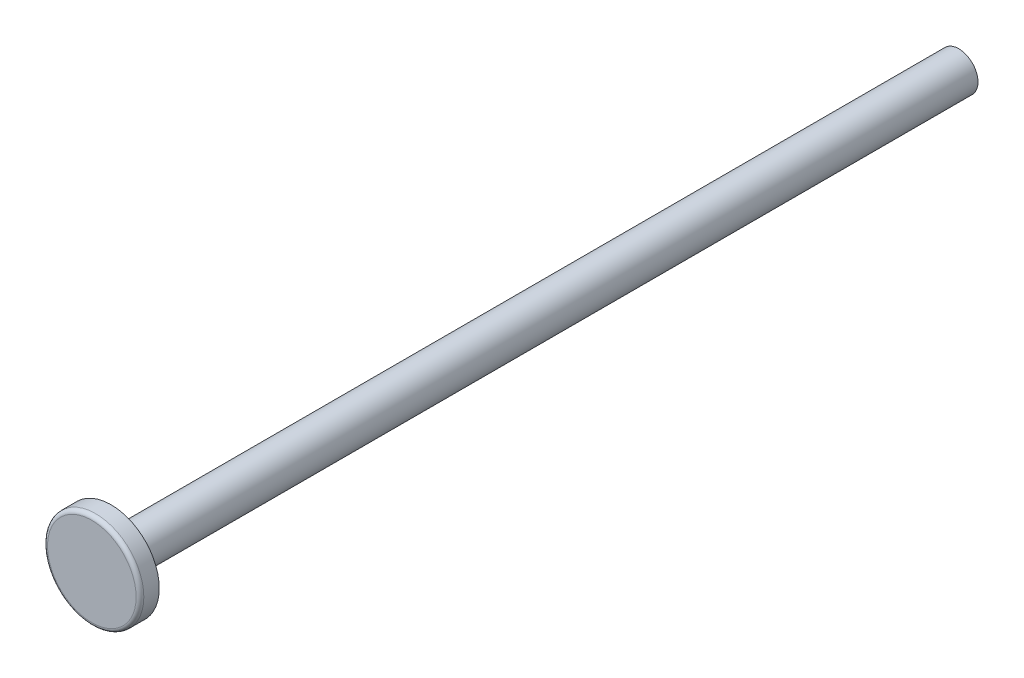
ISO-10303-21;
HEADER;
FILE_DESCRIPTION(('STEP AP214'),'2;1');
FILE_NAME('part.step','',(''),(''),'','','');
FILE_SCHEMA(('AUTOMOTIVE_DESIGN { 1 0 10303 214 1 1 1 1 }'));
ENDSEC;
DATA;
#1=APPLICATION_CONTEXT('core data for automotive mechanical design processes');
#2=APPLICATION_PROTOCOL_DEFINITION('international standard','automotive_design',2000,#1);
#3=PRODUCT_CONTEXT('',#1,'mechanical');
#4=PRODUCT('Part','Part','',(#3));
#5=PRODUCT_RELATED_PRODUCT_CATEGORY('part','',(#4));
#6=PRODUCT_DEFINITION_FORMATION('','',#4);
#7=PRODUCT_DEFINITION_CONTEXT('part definition',#1,'design');
#8=PRODUCT_DEFINITION('design','',#6,#7);
#9=PRODUCT_DEFINITION_SHAPE('','',#8);
#10=(LENGTH_UNIT() NAMED_UNIT(*) SI_UNIT(.MILLI.,.METRE.));
#11=(NAMED_UNIT(*) PLANE_ANGLE_UNIT() SI_UNIT($,.RADIAN.));
#12=(NAMED_UNIT(*) SI_UNIT($,.STERADIAN.) SOLID_ANGLE_UNIT());
#13=UNCERTAINTY_MEASURE_WITH_UNIT(LENGTH_MEASURE(1.E-05),#10,'distance_accuracy_value','');
#14=(GEOMETRIC_REPRESENTATION_CONTEXT(3) GLOBAL_UNCERTAINTY_ASSIGNED_CONTEXT((#13)) GLOBAL_UNIT_ASSIGNED_CONTEXT((#10,
#11,#12)) REPRESENTATION_CONTEXT('',''));
#15=CARTESIAN_POINT('',(0.,0.,0.));
#16=DIRECTION('',(0.,0.,1.));
#17=DIRECTION('',(1.,0.,0.));
#18=AXIS2_PLACEMENT_3D('',#15,#16,#17);
#19=CARTESIAN_POINT('',(0.,0.,110.));
#20=DIRECTION('',(0.,0.,-1.));
#21=DIRECTION('',(-1.,0.,0.));
#22=AXIS2_PLACEMENT_3D('',#19,#20,#21);
#23=CYLINDRICAL_SURFACE('',#22,5.);
#24=CARTESIAN_POINT('',(0.,0.,110.));
#25=DIRECTION('',(0.,0.,1.));
#26=DIRECTION('',(1.,0.,0.));
#27=AXIS2_PLACEMENT_3D('',#24,#25,#26);
#28=CIRCLE('',#27,5.);
#29=CARTESIAN_POINT('',(5.,0.,110.));
#30=VERTEX_POINT('',#29);
#31=EDGE_CURVE('E46',#30,#30,#28,.T.);
#32=ORIENTED_EDGE('',*,*,#31,.F.);
#33=EDGE_LOOP('',(#32));
#34=FACE_BOUND('',#33,.T.);
#35=CARTESIAN_POINT('',(0.,0.,-110.));
#36=DIRECTION('',(0.,0.,1.));
#37=DIRECTION('',(1.,0.,0.));
#38=AXIS2_PLACEMENT_3D('',#35,#36,#37);
#39=CIRCLE('',#38,5.);
#40=CARTESIAN_POINT('',(5.,0.,-110.));
#41=VERTEX_POINT('',#40);
#42=EDGE_CURVE('E50',#41,#41,#39,.T.);
#43=ORIENTED_EDGE('',*,*,#42,.T.);
#44=EDGE_LOOP('',(#43));
#45=FACE_BOUND('',#44,.T.);
#46=ADVANCED_FACE('F35',(#34,#45),#23,.T.);
#47=CARTESIAN_POINT('',(0.,0.,-110.));
#48=DIRECTION('',(0.,0.,1.));
#49=DIRECTION('',(1.,0.,0.));
#50=AXIS2_PLACEMENT_3D('',#47,#48,#49);
#51=PLANE('',#50);
#52=ORIENTED_EDGE('',*,*,#42,.F.);
#53=EDGE_LOOP('',(#52));
#54=FACE_BOUND('',#53,.T.);
#55=ADVANCED_FACE('F74',(#54),#51,.F.);
#56=CARTESIAN_POINT('',(0.,0.,115.));
#57=DIRECTION('',(0.,0.,-1.));
#58=DIRECTION('',(-1.,0.,0.));
#59=AXIS2_PLACEMENT_3D('',#56,#57,#58);
#60=CYLINDRICAL_SURFACE('',#59,12.5);
#61=CARTESIAN_POINT('',(0.,0.,114.));
#62=DIRECTION('',(0.,0.,1.));
#63=DIRECTION('',(1.,0.,0.));
#64=AXIS2_PLACEMENT_3D('',#61,#62,#63);
#65=CIRCLE('',#64,12.5);
#66=CARTESIAN_POINT('',(12.5,0.,114.));
#67=VERTEX_POINT('',#66);
#68=EDGE_CURVE('E10',#67,#67,#65,.F.);
#69=ORIENTED_EDGE('',*,*,#68,.T.);
#70=EDGE_LOOP('',(#69));
#71=FACE_BOUND('',#70,.T.);
#72=CARTESIAN_POINT('',(0.,0.,110.));
#73=DIRECTION('',(0.,0.,1.));
#74=DIRECTION('',(1.,0.,0.));
#75=AXIS2_PLACEMENT_3D('',#72,#73,#74);
#76=CIRCLE('',#75,12.5);
#77=CARTESIAN_POINT('',(12.5,0.,110.));
#78=VERTEX_POINT('',#77);
#79=EDGE_CURVE('E54',#78,#78,#76,.T.);
#80=ORIENTED_EDGE('',*,*,#79,.T.);
#81=EDGE_LOOP('',(#80));
#82=FACE_BOUND('',#81,.T.);
#83=ADVANCED_FACE('F59',(#71,#82),#60,.T.);
#84=CARTESIAN_POINT('',(0.,0.,115.));
#85=DIRECTION('',(0.,0.,1.));
#86=DIRECTION('',(1.,0.,0.));
#87=AXIS2_PLACEMENT_3D('',#84,#85,#86);
#88=PLANE('',#87);
#89=CARTESIAN_POINT('',(0.,0.,115.));
#90=DIRECTION('',(0.,0.,1.));
#91=DIRECTION('',(1.,0.,0.));
#92=AXIS2_PLACEMENT_3D('',#89,#90,#91);
#93=CIRCLE('',#92,11.5);
#94=CARTESIAN_POINT('',(11.5,0.,115.));
#95=VERTEX_POINT('',#94);
#96=EDGE_CURVE('E42',#95,#95,#93,.T.);
#97=ORIENTED_EDGE('',*,*,#96,.T.);
#98=EDGE_LOOP('',(#97));
#99=FACE_BOUND('',#98,.T.);
#100=ADVANCED_FACE('F63',(#99),#88,.T.);
#101=CARTESIAN_POINT('',(0.,0.,110.));
#102=DIRECTION('',(0.,0.,1.));
#103=DIRECTION('',(1.,0.,0.));
#104=AXIS2_PLACEMENT_3D('',#101,#102,#103);
#105=PLANE('',#104);
#106=ORIENTED_EDGE('',*,*,#31,.T.);
#107=EDGE_LOOP('',(#106));
#108=FACE_BOUND('',#107,.T.);
#109=ORIENTED_EDGE('',*,*,#79,.F.);
#110=EDGE_LOOP('',(#109));
#111=FACE_BOUND('',#110,.T.);
#112=ADVANCED_FACE('F61',(#108,#111),#105,.F.);
#113=CARTESIAN_POINT('',(0.,0.,114.));
#114=DIRECTION('',(0.,0.,1.));
#115=DIRECTION('',(1.,0.,0.));
#116=AXIS2_PLACEMENT_3D('',#113,#114,#115);
#117=TOROIDAL_SURFACE('',#116,11.5,1.);
#118=ORIENTED_EDGE('',*,*,#68,.F.);
#119=EDGE_LOOP('',(#118));
#120=FACE_BOUND('',#119,.T.);
#121=ORIENTED_EDGE('',*,*,#96,.F.);
#122=EDGE_LOOP('',(#121));
#123=FACE_BOUND('',#122,.T.);
#124=ADVANCED_FACE('F37',(#120,#123),#117,.T.);
#125=CLOSED_SHELL('',(#46,#55,#83,#100,#112,#124));
#126=MANIFOLD_SOLID_BREP('B2',#125);
#127=ADVANCED_BREP_SHAPE_REPRESENTATION('',(#18,#126),#14);
#128=SHAPE_DEFINITION_REPRESENTATION(#9,#127);
ENDSEC;
END-ISO-10303-21;
